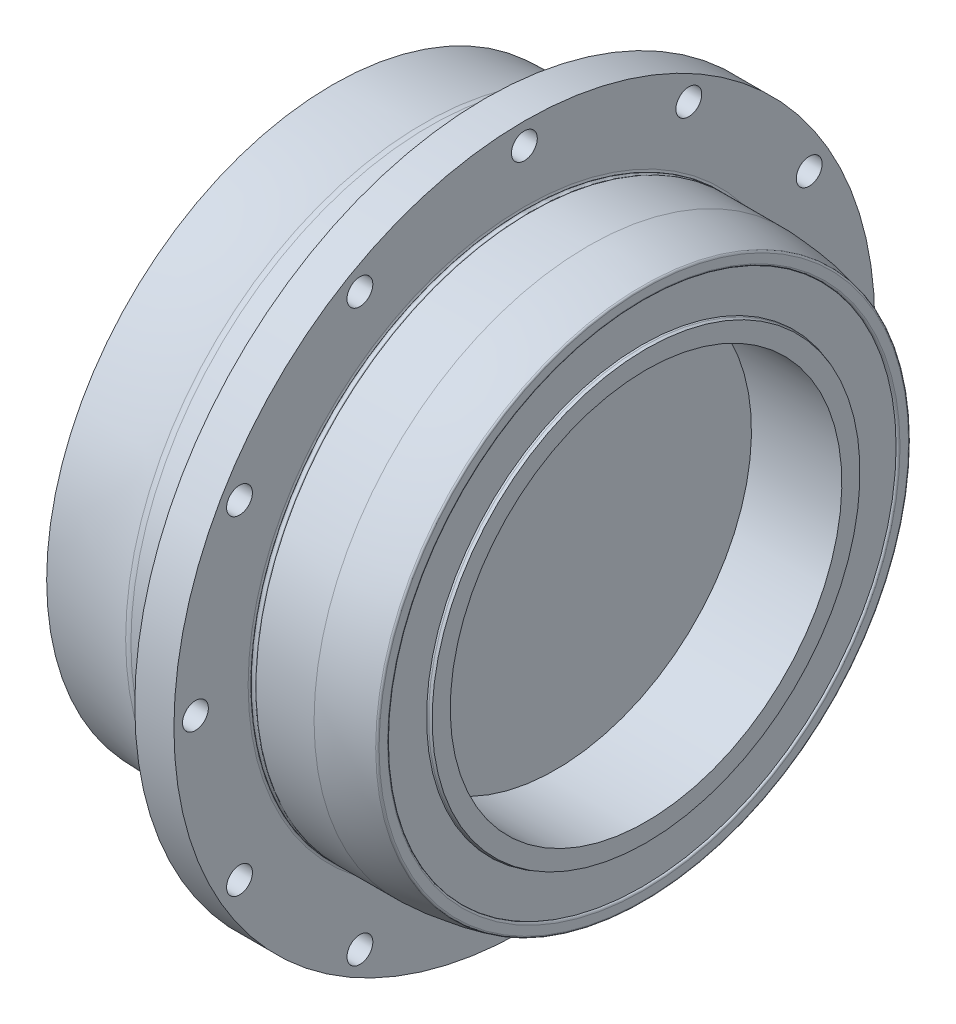
ISO-10303-21;
HEADER;
FILE_DESCRIPTION(('STEP AP214'),'2;1');
FILE_NAME('part.step','',(''),(''),'','','');
FILE_SCHEMA(('AUTOMOTIVE_DESIGN { 1 0 10303 214 1 1 1 1 }'));
ENDSEC;
DATA;
#1=APPLICATION_CONTEXT('core data for automotive mechanical design processes');
#2=APPLICATION_PROTOCOL_DEFINITION('international standard','automotive_design',2000,#1);
#3=PRODUCT_CONTEXT('',#1,'mechanical');
#4=PRODUCT('Part','Part','',(#3));
#5=PRODUCT_RELATED_PRODUCT_CATEGORY('part','',(#4));
#6=PRODUCT_DEFINITION_FORMATION('','',#4);
#7=PRODUCT_DEFINITION_CONTEXT('part definition',#1,'design');
#8=PRODUCT_DEFINITION('design','',#6,#7);
#9=PRODUCT_DEFINITION_SHAPE('','',#8);
#10=(LENGTH_UNIT() NAMED_UNIT(*) SI_UNIT(.MILLI.,.METRE.));
#11=(NAMED_UNIT(*) PLANE_ANGLE_UNIT() SI_UNIT($,.RADIAN.));
#12=(NAMED_UNIT(*) SI_UNIT($,.STERADIAN.) SOLID_ANGLE_UNIT());
#13=UNCERTAINTY_MEASURE_WITH_UNIT(LENGTH_MEASURE(1.E-05),#10,'distance_accuracy_value','');
#14=(GEOMETRIC_REPRESENTATION_CONTEXT(3) GLOBAL_UNCERTAINTY_ASSIGNED_CONTEXT((#13)) GLOBAL_UNIT_ASSIGNED_CONTEXT((#10,
#11,#12)) REPRESENTATION_CONTEXT('',''));
#15=CARTESIAN_POINT('',(0.,0.,0.));
#16=DIRECTION('',(0.,0.,1.));
#17=DIRECTION('',(1.,0.,0.));
#18=AXIS2_PLACEMENT_3D('',#15,#16,#17);
#19=CARTESIAN_POINT('',(56.9999999999999,0.,0.));
#20=DIRECTION('',(-1.,0.,0.));
#21=DIRECTION('',(0.,-1.,0.));
#22=AXIS2_PLACEMENT_3D('',#19,#20,#21);
#23=PLANE('',#22);
#24=CARTESIAN_POINT('',(56.9999999999999,0.,0.));
#25=DIRECTION('',(1.,0.,0.));
#26=DIRECTION('',(0.,1.,0.));
#27=AXIS2_PLACEMENT_3D('',#24,#25,#26);
#28=CIRCLE('',#27,50.);
#29=CARTESIAN_POINT('',(56.9999999999999,50.,0.));
#30=VERTEX_POINT('',#29);
#31=EDGE_CURVE('E271',#30,#30,#28,.T.);
#32=ORIENTED_EDGE('',*,*,#31,.T.);
#33=EDGE_LOOP('',(#32));
#34=FACE_BOUND('',#33,.T.);
#35=ADVANCED_FACE('F16',(#34),#23,.F.);
#36=CARTESIAN_POINT('',(86.9999999999999,0.,0.));
#37=DIRECTION('',(1.,0.,0.));
#38=DIRECTION('',(0.,1.,0.));
#39=AXIS2_PLACEMENT_3D('',#36,#37,#38);
#40=CYLINDRICAL_SURFACE('',#39,50.);
#41=CARTESIAN_POINT('',(80.0750000000017,0.,0.));
#42=DIRECTION('',(1.,0.,0.));
#43=DIRECTION('',(0.,1.,0.));
#44=AXIS2_PLACEMENT_3D('',#41,#42,#43);
#45=CIRCLE('',#44,50.);
#46=CARTESIAN_POINT('',(80.0750000000017,50.,0.));
#47=VERTEX_POINT('',#46);
#48=EDGE_CURVE('E269',#47,#47,#45,.T.);
#49=ORIENTED_EDGE('',*,*,#48,.T.);
#50=EDGE_LOOP('',(#49));
#51=FACE_BOUND('',#50,.T.);
#52=ORIENTED_EDGE('',*,*,#31,.F.);
#53=EDGE_LOOP('',(#52));
#54=FACE_BOUND('',#53,.T.);
#55=ADVANCED_FACE('F276',(#51,#54),#40,.F.);
#56=CARTESIAN_POINT('',(80.0750000000019,54.9999999999993,0.));
#57=DIRECTION('',(-1.,0.,0.));
#58=DIRECTION('',(0.,-1.,0.));
#59=AXIS2_PLACEMENT_3D('',#56,#57,#58);
#60=PLANE('',#59);
#61=ORIENTED_EDGE('',*,*,#48,.F.);
#62=EDGE_LOOP('',(#61));
#63=FACE_BOUND('',#62,.T.);
#64=CARTESIAN_POINT('',(80.0749999999993,-4.35852041343093E-13,0.));
#65=DIRECTION('',(-1.,0.,0.));
#66=DIRECTION('',(0.,-1.,0.));
#67=AXIS2_PLACEMENT_3D('',#64,#65,#66);
#68=CIRCLE('',#67,54.6360297657333);
#69=CARTESIAN_POINT('',(80.0749999999969,-54.6360297657338,0.));
#70=VERTEX_POINT('',#69);
#71=EDGE_CURVE('E266',#70,#70,#68,.T.);
#72=ORIENTED_EDGE('',*,*,#71,.F.);
#73=EDGE_LOOP('',(#72));
#74=FACE_BOUND('',#73,.T.);
#75=ADVANCED_FACE('F278',(#63,#74),#60,.F.);
#76=CARTESIAN_POINT('',(79.4063863252338,-4.05925293378572E-13,0.));
#77=DIRECTION('',(-1.,0.,0.));
#78=DIRECTION('',(0.,-1.,0.));
#79=AXIS2_PLACEMENT_3D('',#76,#77,#78);
#80=CONICAL_SURFACE('',#79,54.8793852415713,0.349065850398875);
#81=ORIENTED_EDGE('',*,*,#71,.T.);
#82=EDGE_LOOP('',(#81));
#83=FACE_BOUND('',#82,.T.);
#84=CARTESIAN_POINT('',(79.4063863252338,-4.06341254147805E-13,0.));
#85=DIRECTION('',(1.,0.,0.));
#86=DIRECTION('',(0.,1.,0.));
#87=AXIS2_PLACEMENT_3D('',#84,#85,#86);
#88=CIRCLE('',#87,54.8793852415713);
#89=CARTESIAN_POINT('',(79.4063863252363,54.8793852415709,0.));
#90=VERTEX_POINT('',#89);
#91=EDGE_CURVE('E265',#90,#90,#88,.F.);
#92=ORIENTED_EDGE('',*,*,#91,.F.);
#93=EDGE_LOOP('',(#92));
#94=FACE_BOUND('',#93,.T.);
#95=ADVANCED_FACE('F284',(#83,#94),#80,.T.);
#96=CARTESIAN_POINT('',(78.7223460385825,-3.75598464164455E-13,0.));
#97=DIRECTION('',(1.,0.,0.));
#98=DIRECTION('',(0.,1.,0.));
#99=AXIS2_PLACEMENT_3D('',#96,#97,#98);
#100=TOROIDAL_SURFACE('',#99,52.9999999999995,2.);
#101=CARTESIAN_POINT('',(79.,-3.88077052912043E-13,0.));
#102=DIRECTION('',(1.,0.,0.));
#103=DIRECTION('',(0.,1.,0.));
#104=AXIS2_PLACEMENT_3D('',#101,#102,#103);
#105=CIRCLE('',#104,54.9806333021807);
#106=CARTESIAN_POINT('',(79.0000000000025,54.9806333021803,0.));
#107=VERTEX_POINT('',#106);
#108=EDGE_CURVE('E262',#107,#107,#105,.F.);
#109=ORIENTED_EDGE('',*,*,#108,.F.);
#110=EDGE_LOOP('',(#109));
#111=FACE_BOUND('',#110,.T.);
#112=ORIENTED_EDGE('',*,*,#91,.T.);
#113=EDGE_LOOP('',(#112));
#114=FACE_BOUND('',#113,.T.);
#115=ADVANCED_FACE('F290',(#111,#114),#100,.T.);
#116=CARTESIAN_POINT('',(79.,0.,0.));
#117=DIRECTION('',(1.,0.,0.));
#118=DIRECTION('',(0.,0.,-1.));
#119=AXIS2_PLACEMENT_3D('',#116,#117,#118);
#120=PLANE('',#119);
#121=CARTESIAN_POINT('',(79.,0.,0.));
#122=DIRECTION('',(1.,0.,0.));
#123=DIRECTION('',(0.,0.,-1.));
#124=AXIS2_PLACEMENT_3D('',#121,#122,#123);
#125=CIRCLE('',#124,64.94);
#126=CARTESIAN_POINT('',(79.,0.,-64.94));
#127=VERTEX_POINT('',#126);
#128=EDGE_CURVE('E69',#127,#127,#125,.F.);
#129=ORIENTED_EDGE('',*,*,#128,.F.);
#130=EDGE_LOOP('',(#129));
#131=FACE_BOUND('',#130,.T.);
#132=ORIENTED_EDGE('',*,*,#108,.T.);
#133=EDGE_LOOP('',(#132));
#134=FACE_BOUND('',#133,.T.);
#135=ADVANCED_FACE('F295',(#131,#134),#120,.T.);
#136=CARTESIAN_POINT('',(79.,0.,0.));
#137=DIRECTION('',(1.,0.,0.));
#138=DIRECTION('',(0.,0.,-1.));
#139=AXIS2_PLACEMENT_3D('',#136,#137,#138);
#140=TOROIDAL_SURFACE('',#139,65.44,0.5);
#141=CARTESIAN_POINT('',(79.5,0.,0.));
#142=DIRECTION('',(1.,0.,0.));
#143=DIRECTION('',(0.,0.,1.));
#144=AXIS2_PLACEMENT_3D('',#141,#142,#143);
#145=CIRCLE('',#144,65.44);
#146=CARTESIAN_POINT('',(79.5,0.,-65.44));
#147=VERTEX_POINT('',#146);
#148=CARTESIAN_POINT('',(79.5,0.,65.44));
#149=VERTEX_POINT('',#148);
#150=EDGE_CURVE('E56',#147,#149,#145,.F.);
#151=ORIENTED_EDGE('',*,*,#150,.F.);
#152=CARTESIAN_POINT('',(79.5,0.,0.));
#153=DIRECTION('',(1.,0.,0.));
#154=DIRECTION('',(0.,0.,-1.));
#155=AXIS2_PLACEMENT_3D('',#152,#153,#154);
#156=CIRCLE('',#155,65.44);
#157=EDGE_CURVE('E59',#149,#147,#156,.F.);
#158=ORIENTED_EDGE('',*,*,#157,.F.);
#159=EDGE_LOOP('',(#151,#158));
#160=FACE_BOUND('',#159,.T.);
#161=ORIENTED_EDGE('',*,*,#128,.T.);
#162=EDGE_LOOP('',(#161));
#163=FACE_BOUND('',#162,.T.);
#164=ADVANCED_FACE('F67',(#160,#163),#140,.T.);
#165=CARTESIAN_POINT('',(79.5,68.,0.));
#166=DIRECTION('',(1.,0.,0.));
#167=DIRECTION('',(0.,0.,-1.));
#168=AXIS2_PLACEMENT_3D('',#165,#166,#167);
#169=PLANE('',#168);
#170=CARTESIAN_POINT('',(79.5,0.,0.));
#171=DIRECTION('',(-1.,0.,0.));
#172=DIRECTION('',(0.,0.,1.));
#173=AXIS2_PLACEMENT_3D('',#170,#171,#172);
#174=CIRCLE('',#173,67.6111283110141);
#175=CARTESIAN_POINT('',(79.5,0.,67.6111283110141));
#176=VERTEX_POINT('',#175);
#177=CARTESIAN_POINT('',(79.5,0.,-67.6111283110141));
#178=VERTEX_POINT('',#177);
#179=EDGE_CURVE('E106',#176,#178,#174,.T.);
#180=ORIENTED_EDGE('',*,*,#179,.F.);
#181=CARTESIAN_POINT('',(79.5,0.,0.));
#182=DIRECTION('',(-1.,0.,0.));
#183=DIRECTION('',(0.,0.,-1.));
#184=AXIS2_PLACEMENT_3D('',#181,#182,#183);
#185=CIRCLE('',#184,67.6111283110141);
#186=EDGE_CURVE('E64',#178,#176,#185,.T.);
#187=ORIENTED_EDGE('',*,*,#186,.F.);
#188=EDGE_LOOP('',(#180,#187));
#189=FACE_BOUND('',#188,.T.);
#190=ORIENTED_EDGE('',*,*,#150,.T.);
#191=ORIENTED_EDGE('',*,*,#157,.T.);
#192=EDGE_LOOP('',(#190,#191));
#193=FACE_BOUND('',#192,.T.);
#194=ADVANCED_FACE('F61',(#189,#193),#169,.T.);
#195=CARTESIAN_POINT('',(79.,0.,0.));
#196=DIRECTION('',(1.,0.,0.));
#197=DIRECTION('',(0.,0.,-1.));
#198=AXIS2_PLACEMENT_3D('',#195,#196,#197);
#199=TOROIDAL_SURFACE('',#198,67.6111283110141,0.5);
#200=CARTESIAN_POINT('',(79.121621327082,0.,0.));
#201=DIRECTION('',(-1.,0.,0.));
#202=DIRECTION('',(0.,0.,1.));
#203=AXIS2_PLACEMENT_3D('',#200,#201,#202);
#204=CIRCLE('',#203,68.0961110455509);
#205=CARTESIAN_POINT('',(79.121621327082,0.,68.0961110455509));
#206=VERTEX_POINT('',#205);
#207=EDGE_CURVE('E96',#206,#206,#204,.T.);
#208=ORIENTED_EDGE('',*,*,#207,.F.);
#209=EDGE_LOOP('',(#208));
#210=FACE_BOUND('',#209,.T.);
#211=ORIENTED_EDGE('',*,*,#179,.T.);
#212=ORIENTED_EDGE('',*,*,#186,.T.);
#213=EDGE_LOOP('',(#211,#212));
#214=FACE_BOUND('',#213,.T.);
#215=ADVANCED_FACE('F76',(#210,#214),#199,.T.);
#216=CARTESIAN_POINT('',(63.5,0.,5.8026234567902));
#217=DIRECTION('',(0.,1.,0.));
#218=DIRECTION('',(0.,0.,1.));
#219=AXIS2_PLACEMENT_3D('',#216,#217,#218);
#220=CIRCLE('',#219,64.2223765432098);
#221=TRIMMED_CURVE('',#220,(PARAMETER_VALUE(-1.66127176324042)),
(PARAMETER_VALUE(1.66127176324042)),.T.,.PARAMETER.);
#222=CARTESIAN_POINT('',(63.5,0.,0.));
#223=DIRECTION('',(-1.,0.,0.));
#224=AXIS1_PLACEMENT('',#222,#223);
#225=SURFACE_OF_REVOLUTION('',#221,#224);
#226=ORIENTED_EDGE('',*,*,#207,.T.);
#227=EDGE_LOOP('',(#226));
#228=FACE_BOUND('',#227,.T.);
#229=CARTESIAN_POINT('',(65.2917850951385,0.,0.));
#230=DIRECTION('',(1.,0.,0.));
#231=DIRECTION('',(0.,0.,-1.));
#232=AXIS2_PLACEMENT_3D('',#229,#230,#231);
#233=CIRCLE('',#232,70.);
#234=CARTESIAN_POINT('',(65.2917850951385,0.,-70.));
#235=VERTEX_POINT('',#234);
#236=EDGE_CURVE('E105',#235,#235,#233,.F.);
#237=ORIENTED_EDGE('',*,*,#236,.F.);
#238=EDGE_LOOP('',(#237));
#239=FACE_BOUND('',#238,.T.);
#240=ADVANCED_FACE('F87',(#228,#239),#225,.F.);
#241=CARTESIAN_POINT('',(59.,0.,0.));
#242=DIRECTION('',(1.,0.,0.));
#243=DIRECTION('',(0.,0.,-1.));
#244=AXIS2_PLACEMENT_3D('',#241,#242,#243);
#245=CYLINDRICAL_SURFACE('',#244,70.);
#246=ORIENTED_EDGE('',*,*,#236,.T.);
#247=EDGE_LOOP('',(#246));
#248=FACE_BOUND('',#247,.T.);
#249=CARTESIAN_POINT('',(50.4473720558371,0.,0.));
#250=DIRECTION('',(1.,0.,0.));
#251=DIRECTION('',(0.,0.,-1.));
#252=AXIS2_PLACEMENT_3D('',#249,#250,#251);
#253=CIRCLE('',#252,70.);
#254=CARTESIAN_POINT('',(50.4473720558371,0.,-70.));
#255=VERTEX_POINT('',#254);
#256=EDGE_CURVE('E111',#255,#255,#253,.F.);
#257=ORIENTED_EDGE('',*,*,#256,.F.);
#258=EDGE_LOOP('',(#257));
#259=FACE_BOUND('',#258,.T.);
#260=ADVANCED_FACE('F131',(#248,#259),#245,.T.);
#261=CARTESIAN_POINT('',(50.4473720558371,0.,0.));
#262=DIRECTION('',(1.,0.,0.));
#263=DIRECTION('',(0.,0.,-1.));
#264=AXIS2_PLACEMENT_3D('',#261,#262,#263);
#265=CONICAL_SURFACE('',#264,70.,0.523598775598297);
#266=CARTESIAN_POINT('',(50.2,0.,0.));
#267=DIRECTION('',(-1.,0.,0.));
#268=DIRECTION('',(0.,0.,1.));
#269=AXIS2_PLACEMENT_3D('',#266,#267,#268);
#270=CIRCLE('',#269,69.8571796769725);
#271=CARTESIAN_POINT('',(50.2,0.,69.8571796769725));
#272=VERTEX_POINT('',#271);
#273=EDGE_CURVE('E114',#272,#272,#270,.F.);
#274=ORIENTED_EDGE('',*,*,#273,.T.);
#275=EDGE_LOOP('',(#274));
#276=FACE_BOUND('',#275,.T.);
#277=ORIENTED_EDGE('',*,*,#256,.T.);
#278=EDGE_LOOP('',(#277));
#279=FACE_BOUND('',#278,.T.);
#280=ADVANCED_FACE('F127',(#276,#279),#265,.T.);
#281=CARTESIAN_POINT('',(49.8,0.,0.));
#282=DIRECTION('',(-1.,0.,0.));
#283=DIRECTION('',(0.,0.,1.));
#284=AXIS2_PLACEMENT_3D('',#281,#282,#283);
#285=TOROIDAL_SURFACE('',#284,70.55,0.799999999999997);
#286=ORIENTED_EDGE('',*,*,#273,.F.);
#287=EDGE_LOOP('',(#286));
#288=FACE_BOUND('',#287,.T.);
#289=CARTESIAN_POINT('',(49.2190524980689,0.,0.));
#290=DIRECTION('',(1.,0.,0.));
#291=DIRECTION('',(0.,0.,-1.));
#292=AXIS2_PLACEMENT_3D('',#289,#290,#291);
#293=CIRCLE('',#292,70.);
#294=CARTESIAN_POINT('',(49.2190524980689,0.,-70.));
#295=VERTEX_POINT('',#294);
#296=EDGE_CURVE('E117',#295,#295,#293,.F.);
#297=ORIENTED_EDGE('',*,*,#296,.F.);
#298=EDGE_LOOP('',(#297));
#299=FACE_BOUND('',#298,.T.);
#300=ADVANCED_FACE('F122',(#288,#299),#285,.F.);
#301=CARTESIAN_POINT('',(59.,0.,0.));
#302=DIRECTION('',(1.,0.,0.));
#303=DIRECTION('',(0.,0.,-1.));
#304=AXIS2_PLACEMENT_3D('',#301,#302,#303);
#305=CYLINDRICAL_SURFACE('',#304,70.);
#306=ORIENTED_EDGE('',*,*,#296,.T.);
#307=EDGE_LOOP('',(#306));
#308=FACE_BOUND('',#307,.T.);
#309=CARTESIAN_POINT('',(49.,0.,0.));
#310=DIRECTION('',(1.,0.,0.));
#311=DIRECTION('',(0.,0.,-1.));
#312=AXIS2_PLACEMENT_3D('',#309,#310,#311);
#313=CIRCLE('',#312,70.);
#314=CARTESIAN_POINT('',(49.,0.,-70.));
#315=VERTEX_POINT('',#314);
#316=EDGE_CURVE('E250',#315,#315,#313,.T.);
#317=ORIENTED_EDGE('',*,*,#316,.T.);
#318=EDGE_LOOP('',(#317));
#319=FACE_BOUND('',#318,.T.);
#320=ADVANCED_FACE('F126',(#308,#319),#305,.T.);
#321=CARTESIAN_POINT('',(49.,0.,0.));
#322=DIRECTION('',(-1.,0.,0.));
#323=DIRECTION('',(0.,0.,1.));
#324=AXIS2_PLACEMENT_3D('',#321,#322,#323);
#325=PLANE('',#324);
#326=CARTESIAN_POINT('',(49.,0.,0.));
#327=DIRECTION('',(1.,0.,0.));
#328=DIRECTION('',(0.,0.,-1.));
#329=AXIS2_PLACEMENT_3D('',#326,#327,#328);
#330=CIRCLE('',#329,70.025);
#331=CARTESIAN_POINT('',(49.,0.,-70.025));
#332=VERTEX_POINT('',#331);
#333=EDGE_CURVE('E246',#332,#332,#330,.T.);
#334=ORIENTED_EDGE('',*,*,#333,.T.);
#335=EDGE_LOOP('',(#334));
#336=FACE_BOUND('',#335,.T.);
#337=ORIENTED_EDGE('',*,*,#316,.F.);
#338=EDGE_LOOP('',(#337));
#339=FACE_BOUND('',#338,.T.);
#340=ADVANCED_FACE('F694',(#336,#339),#325,.F.);
#341=CARTESIAN_POINT('',(0.,0.,0.));
#342=DIRECTION('',(1.,0.,0.));
#343=DIRECTION('',(0.,0.,-1.));
#344=AXIS2_PLACEMENT_3D('',#341,#342,#343);
#345=CYLINDRICAL_SURFACE('',#344,70.025);
#346=ORIENTED_EDGE('',*,*,#333,.F.);
#347=EDGE_LOOP('',(#346));
#348=FACE_BOUND('',#347,.T.);
#349=CARTESIAN_POINT('',(49.1963651766175,0.,0.));
#350=DIRECTION('',(-1.,0.,0.));
#351=DIRECTION('',(0.,0.,1.));
#352=AXIS2_PLACEMENT_3D('',#349,#350,#351);
#353=CIRCLE('',#352,70.025);
#354=CARTESIAN_POINT('',(49.1963651766175,0.,70.025));
#355=VERTEX_POINT('',#354);
#356=EDGE_CURVE('E239',#355,#355,#353,.F.);
#357=ORIENTED_EDGE('',*,*,#356,.T.);
#358=EDGE_LOOP('',(#357));
#359=FACE_BOUND('',#358,.T.);
#360=ADVANCED_FACE('F224',(#348,#359),#345,.F.);
#361=CARTESIAN_POINT('',(49.8,0.,0.));
#362=DIRECTION('',(-1.,0.,0.));
#363=DIRECTION('',(0.,0.,1.));
#364=AXIS2_PLACEMENT_3D('',#361,#362,#363);
#365=TOROIDAL_SURFACE('',#364,70.55,0.799999999999997);
#366=ORIENTED_EDGE('',*,*,#356,.F.);
#367=EDGE_LOOP('',(#366));
#368=FACE_BOUND('',#367,.T.);
#369=CARTESIAN_POINT('',(49.,0.,0.));
#370=DIRECTION('',(1.,0.,0.));
#371=DIRECTION('',(0.,0.,1.));
#372=AXIS2_PLACEMENT_3D('',#369,#370,#371);
#373=CIRCLE('',#372,70.55);
#374=CARTESIAN_POINT('',(49.,0.,-70.55));
#375=VERTEX_POINT('',#374);
#376=CARTESIAN_POINT('',(49.,0.,70.55));
#377=VERTEX_POINT('',#376);
#378=EDGE_CURVE('E208',#375,#377,#373,.F.);
#379=ORIENTED_EDGE('',*,*,#378,.F.);
#380=CARTESIAN_POINT('',(49.,0.,0.));
#381=DIRECTION('',(1.,0.,0.));
#382=DIRECTION('',(0.,0.,-1.));
#383=AXIS2_PLACEMENT_3D('',#380,#381,#382);
#384=CIRCLE('',#383,70.55);
#385=EDGE_CURVE('E236',#377,#375,#384,.F.);
#386=ORIENTED_EDGE('',*,*,#385,.F.);
#387=EDGE_LOOP('',(#379,#386));
#388=FACE_BOUND('',#387,.T.);
#389=ADVANCED_FACE('F212',(#368,#388),#365,.F.);
#390=CARTESIAN_POINT('',(49.,89.5,0.));
#391=DIRECTION('',(1.,0.,0.));
#392=DIRECTION('',(0.,0.,-1.));
#393=AXIS2_PLACEMENT_3D('',#390,#391,#392);
#394=PLANE('',#393);
#395=CARTESIAN_POINT('',(49.,0.,0.));
#396=DIRECTION('',(1.,0.,0.));
#397=DIRECTION('',(0.,0.,-1.));
#398=AXIS2_PLACEMENT_3D('',#395,#396,#397);
#399=CIRCLE('',#398,89.5);
#400=CARTESIAN_POINT('',(49.,0.,-89.5));
#401=VERTEX_POINT('',#400);
#402=EDGE_CURVE('E347',#401,#401,#399,.F.);
#403=ORIENTED_EDGE('',*,*,#402,.F.);
#404=EDGE_LOOP('',(#403));
#405=FACE_BOUND('',#404,.T.);
#406=CARTESIAN_POINT('',(49.,84.,0.));
#407=DIRECTION('',(-1.,0.,0.));
#408=DIRECTION('',(0.,0.,1.));
#409=AXIS2_PLACEMENT_3D('',#406,#407,#408);
#410=CIRCLE('',#409,3.3);
#411=CARTESIAN_POINT('',(49.,84.,3.3));
#412=VERTEX_POINT('',#411);
#413=EDGE_CURVE('E350',#412,#412,#410,.T.);
#414=ORIENTED_EDGE('',*,*,#413,.T.);
#415=EDGE_LOOP('',(#414));
#416=FACE_BOUND('',#415,.T.);
#417=CARTESIAN_POINT('',(49.,72.7461339178929,42.));
#418=DIRECTION('',(-1.,0.,0.));
#419=DIRECTION('',(0.,0.,1.));
#420=AXIS2_PLACEMENT_3D('',#417,#418,#419);
#421=CIRCLE('',#420,3.3);
#422=CARTESIAN_POINT('',(49.,72.7461339178929,45.3));
#423=VERTEX_POINT('',#422);
#424=EDGE_CURVE('E353',#423,#423,#421,.T.);
#425=ORIENTED_EDGE('',*,*,#424,.T.);
#426=EDGE_LOOP('',(#425));
#427=FACE_BOUND('',#426,.T.);
#428=CARTESIAN_POINT('',(49.,42.,72.7461339178928));
#429=DIRECTION('',(-1.,0.,0.));
#430=DIRECTION('',(0.,0.,1.));
#431=AXIS2_PLACEMENT_3D('',#428,#429,#430);
#432=CIRCLE('',#431,3.3);
#433=CARTESIAN_POINT('',(49.,42.,76.0461339178928));
#434=VERTEX_POINT('',#433);
#435=EDGE_CURVE('E356',#434,#434,#432,.T.);
#436=ORIENTED_EDGE('',*,*,#435,.T.);
#437=EDGE_LOOP('',(#436));
#438=FACE_BOUND('',#437,.T.);
#439=CARTESIAN_POINT('',(49.,0.,84.));
#440=DIRECTION('',(-1.,0.,0.));
#441=DIRECTION('',(0.,0.,1.));
#442=AXIS2_PLACEMENT_3D('',#439,#440,#441);
#443=CIRCLE('',#442,3.3);
#444=CARTESIAN_POINT('',(49.,0.,87.3));
#445=VERTEX_POINT('',#444);
#446=EDGE_CURVE('E359',#445,#445,#443,.T.);
#447=ORIENTED_EDGE('',*,*,#446,.T.);
#448=EDGE_LOOP('',(#447));
#449=FACE_BOUND('',#448,.T.);
#450=CARTESIAN_POINT('',(49.,-42.,72.7461339178929));
#451=DIRECTION('',(-1.,0.,0.));
#452=DIRECTION('',(0.,0.,1.));
#453=AXIS2_PLACEMENT_3D('',#450,#451,#452);
#454=CIRCLE('',#453,3.3);
#455=CARTESIAN_POINT('',(49.,-42.,76.0461339178929));
#456=VERTEX_POINT('',#455);
#457=EDGE_CURVE('E362',#456,#456,#454,.T.);
#458=ORIENTED_EDGE('',*,*,#457,.T.);
#459=EDGE_LOOP('',(#458));
#460=FACE_BOUND('',#459,.T.);
#461=CARTESIAN_POINT('',(49.,-72.7461339178928,42.));
#462=DIRECTION('',(-1.,0.,0.));
#463=DIRECTION('',(0.,0.,1.));
#464=AXIS2_PLACEMENT_3D('',#461,#462,#463);
#465=CIRCLE('',#464,3.3);
#466=CARTESIAN_POINT('',(49.,-72.7461339178928,45.3));
#467=VERTEX_POINT('',#466);
#468=EDGE_CURVE('E365',#467,#467,#465,.T.);
#469=ORIENTED_EDGE('',*,*,#468,.T.);
#470=EDGE_LOOP('',(#469));
#471=FACE_BOUND('',#470,.T.);
#472=CARTESIAN_POINT('',(49.,-84.,0.));
#473=DIRECTION('',(-1.,0.,0.));
#474=DIRECTION('',(0.,0.,1.));
#475=AXIS2_PLACEMENT_3D('',#472,#473,#474);
#476=CIRCLE('',#475,3.3);
#477=CARTESIAN_POINT('',(49.,-84.,3.30000000000005));
#478=VERTEX_POINT('',#477);
#479=EDGE_CURVE('E368',#478,#478,#476,.T.);
#480=ORIENTED_EDGE('',*,*,#479,.T.);
#481=EDGE_LOOP('',(#480));
#482=FACE_BOUND('',#481,.T.);
#483=CARTESIAN_POINT('',(49.,-72.7461339178929,-42.));
#484=DIRECTION('',(-1.,0.,0.));
#485=DIRECTION('',(0.,0.,1.));
#486=AXIS2_PLACEMENT_3D('',#483,#484,#485);
#487=CIRCLE('',#486,3.3);
#488=CARTESIAN_POINT('',(49.,-72.7461339178929,-38.7));
#489=VERTEX_POINT('',#488);
#490=EDGE_CURVE('E371',#489,#489,#487,.T.);
#491=ORIENTED_EDGE('',*,*,#490,.T.);
#492=EDGE_LOOP('',(#491));
#493=FACE_BOUND('',#492,.T.);
#494=CARTESIAN_POINT('',(49.,-42.0000000000001,-72.7461339178928));
#495=DIRECTION('',(-1.,0.,0.));
#496=DIRECTION('',(0.,0.,1.));
#497=AXIS2_PLACEMENT_3D('',#494,#495,#496);
#498=CIRCLE('',#497,3.3);
#499=CARTESIAN_POINT('',(49.,-42.0000000000001,-69.4461339178928));
#500=VERTEX_POINT('',#499);
#501=EDGE_CURVE('E374',#500,#500,#498,.T.);
#502=ORIENTED_EDGE('',*,*,#501,.T.);
#503=EDGE_LOOP('',(#502));
#504=FACE_BOUND('',#503,.T.);
#505=CARTESIAN_POINT('',(49.,0.,-84.));
#506=DIRECTION('',(-1.,0.,0.));
#507=DIRECTION('',(0.,0.,1.));
#508=AXIS2_PLACEMENT_3D('',#505,#506,#507);
#509=CIRCLE('',#508,3.3);
#510=CARTESIAN_POINT('',(49.,0.,-80.7));
#511=VERTEX_POINT('',#510);
#512=EDGE_CURVE('E377',#511,#511,#509,.T.);
#513=ORIENTED_EDGE('',*,*,#512,.T.);
#514=EDGE_LOOP('',(#513));
#515=FACE_BOUND('',#514,.T.);
#516=CARTESIAN_POINT('',(49.,41.9999999999999,-72.7461339178929));
#517=DIRECTION('',(-1.,0.,0.));
#518=DIRECTION('',(0.,0.,1.));
#519=AXIS2_PLACEMENT_3D('',#516,#517,#518);
#520=CIRCLE('',#519,3.3);
#521=CARTESIAN_POINT('',(49.,41.9999999999999,-69.4461339178929));
#522=VERTEX_POINT('',#521);
#523=EDGE_CURVE('E379',#522,#522,#520,.T.);
#524=ORIENTED_EDGE('',*,*,#523,.T.);
#525=EDGE_LOOP('',(#524));
#526=FACE_BOUND('',#525,.T.);
#527=CARTESIAN_POINT('',(49.,72.7461339178928,-42.0000000000001));
#528=DIRECTION('',(-1.,0.,0.));
#529=DIRECTION('',(0.,0.,1.));
#530=AXIS2_PLACEMENT_3D('',#527,#528,#529);
#531=CIRCLE('',#530,3.3);
#532=CARTESIAN_POINT('',(49.,72.7461339178928,-38.7000000000001));
#533=VERTEX_POINT('',#532);
#534=EDGE_CURVE('E257',#533,#533,#531,.T.);
#535=ORIENTED_EDGE('',*,*,#534,.T.);
#536=EDGE_LOOP('',(#535));
#537=FACE_BOUND('',#536,.T.);
#538=ORIENTED_EDGE('',*,*,#378,.T.);
#539=ORIENTED_EDGE('',*,*,#385,.T.);
#540=EDGE_LOOP('',(#538,#539));
#541=FACE_BOUND('',#540,.T.);
#542=ADVANCED_FACE('F223',(#405,#416,#427,#438,#449,#460,#471,#482,#493,#504,#515,#526,#537,
#541),#394,.T.);
#543=CARTESIAN_POINT('',(39.,72.7461339178928,-42.0000000000001));
#544=DIRECTION('',(-1.,0.,0.));
#545=DIRECTION('',(0.,0.,1.));
#546=AXIS2_PLACEMENT_3D('',#543,#544,#545);
#547=CYLINDRICAL_SURFACE('',#546,3.3);
#548=CARTESIAN_POINT('',(39.,72.7461339178928,-42.0000000000001));
#549=DIRECTION('',(-1.,0.,0.));
#550=DIRECTION('',(0.,0.,1.));
#551=AXIS2_PLACEMENT_3D('',#548,#549,#550);
#552=CIRCLE('',#551,3.3);
#553=CARTESIAN_POINT('',(39.,72.7461339178928,-38.7000000000001));
#554=VERTEX_POINT('',#553);
#555=EDGE_CURVE('E344',#554,#554,#552,.F.);
#556=ORIENTED_EDGE('',*,*,#555,.F.);
#557=EDGE_LOOP('',(#556));
#558=FACE_BOUND('',#557,.T.);
#559=ORIENTED_EDGE('',*,*,#534,.F.);
#560=EDGE_LOOP('',(#559));
#561=FACE_BOUND('',#560,.T.);
#562=ADVANCED_FACE('F396',(#558,#561),#547,.F.);
#563=CARTESIAN_POINT('',(39.,41.9999999999999,-72.7461339178929));
#564=DIRECTION('',(-1.,0.,0.));
#565=DIRECTION('',(0.,0.,1.));
#566=AXIS2_PLACEMENT_3D('',#563,#564,#565);
#567=CYLINDRICAL_SURFACE('',#566,3.3);
#568=CARTESIAN_POINT('',(39.,41.9999999999999,-72.7461339178929));
#569=DIRECTION('',(-1.,0.,0.));
#570=DIRECTION('',(0.,0.,1.));
#571=AXIS2_PLACEMENT_3D('',#568,#569,#570);
#572=CIRCLE('',#571,3.3);
#573=CARTESIAN_POINT('',(39.,41.9999999999999,-69.4461339178929));
#574=VERTEX_POINT('',#573);
#575=EDGE_CURVE('E341',#574,#574,#572,.F.);
#576=ORIENTED_EDGE('',*,*,#575,.F.);
#577=EDGE_LOOP('',(#576));
#578=FACE_BOUND('',#577,.T.);
#579=ORIENTED_EDGE('',*,*,#523,.F.);
#580=EDGE_LOOP('',(#579));
#581=FACE_BOUND('',#580,.T.);
#582=ADVANCED_FACE('F401',(#578,#581),#567,.F.);
#583=CARTESIAN_POINT('',(39.,0.,-84.));
#584=DIRECTION('',(-1.,0.,0.));
#585=DIRECTION('',(0.,0.,1.));
#586=AXIS2_PLACEMENT_3D('',#583,#584,#585);
#587=CYLINDRICAL_SURFACE('',#586,3.3);
#588=CARTESIAN_POINT('',(39.,0.,-84.));
#589=DIRECTION('',(-1.,0.,0.));
#590=DIRECTION('',(0.,0.,1.));
#591=AXIS2_PLACEMENT_3D('',#588,#589,#590);
#592=CIRCLE('',#591,3.3);
#593=CARTESIAN_POINT('',(39.,0.,-80.7));
#594=VERTEX_POINT('',#593);
#595=EDGE_CURVE('E338',#594,#594,#592,.F.);
#596=ORIENTED_EDGE('',*,*,#595,.F.);
#597=EDGE_LOOP('',(#596));
#598=FACE_BOUND('',#597,.T.);
#599=ORIENTED_EDGE('',*,*,#512,.F.);
#600=EDGE_LOOP('',(#599));
#601=FACE_BOUND('',#600,.T.);
#602=ADVANCED_FACE('F425',(#598,#601),#587,.F.);
#603=CARTESIAN_POINT('',(39.,-42.0000000000001,-72.7461339178928));
#604=DIRECTION('',(-1.,0.,0.));
#605=DIRECTION('',(0.,0.,1.));
#606=AXIS2_PLACEMENT_3D('',#603,#604,#605);
#607=CYLINDRICAL_SURFACE('',#606,3.3);
#608=CARTESIAN_POINT('',(39.,-42.0000000000001,-72.7461339178928));
#609=DIRECTION('',(-1.,0.,0.));
#610=DIRECTION('',(0.,0.,1.));
#611=AXIS2_PLACEMENT_3D('',#608,#609,#610);
#612=CIRCLE('',#611,3.3);
#613=CARTESIAN_POINT('',(39.,-42.0000000000001,-69.4461339178928));
#614=VERTEX_POINT('',#613);
#615=EDGE_CURVE('E335',#614,#614,#612,.F.);
#616=ORIENTED_EDGE('',*,*,#615,.F.);
#617=EDGE_LOOP('',(#616));
#618=FACE_BOUND('',#617,.T.);
#619=ORIENTED_EDGE('',*,*,#501,.F.);
#620=EDGE_LOOP('',(#619));
#621=FACE_BOUND('',#620,.T.);
#622=ADVANCED_FACE('F427',(#618,#621),#607,.F.);
#623=CARTESIAN_POINT('',(39.,-72.7461339178929,-42.));
#624=DIRECTION('',(-1.,0.,0.));
#625=DIRECTION('',(0.,0.,1.));
#626=AXIS2_PLACEMENT_3D('',#623,#624,#625);
#627=CYLINDRICAL_SURFACE('',#626,3.3);
#628=CARTESIAN_POINT('',(39.,-72.7461339178929,-42.));
#629=DIRECTION('',(-1.,0.,0.));
#630=DIRECTION('',(0.,0.,1.));
#631=AXIS2_PLACEMENT_3D('',#628,#629,#630);
#632=CIRCLE('',#631,3.3);
#633=CARTESIAN_POINT('',(39.,-72.7461339178929,-38.7));
#634=VERTEX_POINT('',#633);
#635=EDGE_CURVE('E332',#634,#634,#632,.F.);
#636=ORIENTED_EDGE('',*,*,#635,.F.);
#637=EDGE_LOOP('',(#636));
#638=FACE_BOUND('',#637,.T.);
#639=ORIENTED_EDGE('',*,*,#490,.F.);
#640=EDGE_LOOP('',(#639));
#641=FACE_BOUND('',#640,.T.);
#642=ADVANCED_FACE('F434',(#638,#641),#627,.F.);
#643=CARTESIAN_POINT('',(39.,-84.,0.));
#644=DIRECTION('',(-1.,0.,0.));
#645=DIRECTION('',(0.,0.,1.));
#646=AXIS2_PLACEMENT_3D('',#643,#644,#645);
#647=CYLINDRICAL_SURFACE('',#646,3.3);
#648=CARTESIAN_POINT('',(39.,-84.,0.));
#649=DIRECTION('',(-1.,0.,0.));
#650=DIRECTION('',(0.,0.,1.));
#651=AXIS2_PLACEMENT_3D('',#648,#649,#650);
#652=CIRCLE('',#651,3.3);
#653=CARTESIAN_POINT('',(39.,-84.,3.30000000000005));
#654=VERTEX_POINT('',#653);
#655=EDGE_CURVE('E329',#654,#654,#652,.F.);
#656=ORIENTED_EDGE('',*,*,#655,.F.);
#657=EDGE_LOOP('',(#656));
#658=FACE_BOUND('',#657,.T.);
#659=ORIENTED_EDGE('',*,*,#479,.F.);
#660=EDGE_LOOP('',(#659));
#661=FACE_BOUND('',#660,.T.);
#662=ADVANCED_FACE('F443',(#658,#661),#647,.F.);
#663=CARTESIAN_POINT('',(39.,-72.7461339178928,42.));
#664=DIRECTION('',(-1.,0.,0.));
#665=DIRECTION('',(0.,0.,1.));
#666=AXIS2_PLACEMENT_3D('',#663,#664,#665);
#667=CYLINDRICAL_SURFACE('',#666,3.3);
#668=CARTESIAN_POINT('',(39.,-72.7461339178928,42.));
#669=DIRECTION('',(-1.,0.,0.));
#670=DIRECTION('',(0.,0.,1.));
#671=AXIS2_PLACEMENT_3D('',#668,#669,#670);
#672=CIRCLE('',#671,3.3);
#673=CARTESIAN_POINT('',(39.,-72.7461339178928,45.3));
#674=VERTEX_POINT('',#673);
#675=EDGE_CURVE('E326',#674,#674,#672,.F.);
#676=ORIENTED_EDGE('',*,*,#675,.F.);
#677=EDGE_LOOP('',(#676));
#678=FACE_BOUND('',#677,.T.);
#679=ORIENTED_EDGE('',*,*,#468,.F.);
#680=EDGE_LOOP('',(#679));
#681=FACE_BOUND('',#680,.T.);
#682=ADVANCED_FACE('F447',(#678,#681),#667,.F.);
#683=CARTESIAN_POINT('',(39.,-42.,72.7461339178929));
#684=DIRECTION('',(-1.,0.,0.));
#685=DIRECTION('',(0.,0.,1.));
#686=AXIS2_PLACEMENT_3D('',#683,#684,#685);
#687=CYLINDRICAL_SURFACE('',#686,3.3);
#688=CARTESIAN_POINT('',(39.,-42.,72.7461339178929));
#689=DIRECTION('',(-1.,0.,0.));
#690=DIRECTION('',(0.,0.,1.));
#691=AXIS2_PLACEMENT_3D('',#688,#689,#690);
#692=CIRCLE('',#691,3.3);
#693=CARTESIAN_POINT('',(39.,-42.,76.0461339178929));
#694=VERTEX_POINT('',#693);
#695=EDGE_CURVE('E323',#694,#694,#692,.F.);
#696=ORIENTED_EDGE('',*,*,#695,.F.);
#697=EDGE_LOOP('',(#696));
#698=FACE_BOUND('',#697,.T.);
#699=ORIENTED_EDGE('',*,*,#457,.F.);
#700=EDGE_LOOP('',(#699));
#701=FACE_BOUND('',#700,.T.);
#702=ADVANCED_FACE('F451',(#698,#701),#687,.F.);
#703=CARTESIAN_POINT('',(39.,0.,84.));
#704=DIRECTION('',(-1.,0.,0.));
#705=DIRECTION('',(0.,0.,1.));
#706=AXIS2_PLACEMENT_3D('',#703,#704,#705);
#707=CYLINDRICAL_SURFACE('',#706,3.3);
#708=CARTESIAN_POINT('',(39.,0.,84.));
#709=DIRECTION('',(-1.,0.,0.));
#710=DIRECTION('',(0.,0.,1.));
#711=AXIS2_PLACEMENT_3D('',#708,#709,#710);
#712=CIRCLE('',#711,3.3);
#713=CARTESIAN_POINT('',(39.,0.,87.3));
#714=VERTEX_POINT('',#713);
#715=EDGE_CURVE('E320',#714,#714,#712,.F.);
#716=ORIENTED_EDGE('',*,*,#715,.F.);
#717=EDGE_LOOP('',(#716));
#718=FACE_BOUND('',#717,.T.);
#719=ORIENTED_EDGE('',*,*,#446,.F.);
#720=EDGE_LOOP('',(#719));
#721=FACE_BOUND('',#720,.T.);
#722=ADVANCED_FACE('F455',(#718,#721),#707,.F.);
#723=CARTESIAN_POINT('',(39.,42.,72.7461339178928));
#724=DIRECTION('',(-1.,0.,0.));
#725=DIRECTION('',(0.,0.,1.));
#726=AXIS2_PLACEMENT_3D('',#723,#724,#725);
#727=CYLINDRICAL_SURFACE('',#726,3.3);
#728=CARTESIAN_POINT('',(39.,42.,72.7461339178928));
#729=DIRECTION('',(-1.,0.,0.));
#730=DIRECTION('',(0.,0.,1.));
#731=AXIS2_PLACEMENT_3D('',#728,#729,#730);
#732=CIRCLE('',#731,3.3);
#733=CARTESIAN_POINT('',(39.,42.,76.0461339178928));
#734=VERTEX_POINT('',#733);
#735=EDGE_CURVE('E317',#734,#734,#732,.F.);
#736=ORIENTED_EDGE('',*,*,#735,.F.);
#737=EDGE_LOOP('',(#736));
#738=FACE_BOUND('',#737,.T.);
#739=ORIENTED_EDGE('',*,*,#435,.F.);
#740=EDGE_LOOP('',(#739));
#741=FACE_BOUND('',#740,.T.);
#742=ADVANCED_FACE('F459',(#738,#741),#727,.F.);
#743=CARTESIAN_POINT('',(39.,72.7461339178929,42.));
#744=DIRECTION('',(-1.,0.,0.));
#745=DIRECTION('',(0.,0.,1.));
#746=AXIS2_PLACEMENT_3D('',#743,#744,#745);
#747=CYLINDRICAL_SURFACE('',#746,3.3);
#748=CARTESIAN_POINT('',(39.,72.7461339178929,42.));
#749=DIRECTION('',(-1.,0.,0.));
#750=DIRECTION('',(0.,0.,1.));
#751=AXIS2_PLACEMENT_3D('',#748,#749,#750);
#752=CIRCLE('',#751,3.3);
#753=CARTESIAN_POINT('',(39.,72.7461339178929,45.3));
#754=VERTEX_POINT('',#753);
#755=EDGE_CURVE('E314',#754,#754,#752,.F.);
#756=ORIENTED_EDGE('',*,*,#755,.F.);
#757=EDGE_LOOP('',(#756));
#758=FACE_BOUND('',#757,.T.);
#759=ORIENTED_EDGE('',*,*,#424,.F.);
#760=EDGE_LOOP('',(#759));
#761=FACE_BOUND('',#760,.T.);
#762=ADVANCED_FACE('F463',(#758,#761),#747,.F.);
#763=CARTESIAN_POINT('',(39.,84.,0.));
#764=DIRECTION('',(-1.,0.,0.));
#765=DIRECTION('',(0.,0.,1.));
#766=AXIS2_PLACEMENT_3D('',#763,#764,#765);
#767=CYLINDRICAL_SURFACE('',#766,3.3);
#768=CARTESIAN_POINT('',(39.,84.,0.));
#769=DIRECTION('',(-1.,0.,0.));
#770=DIRECTION('',(0.,0.,1.));
#771=AXIS2_PLACEMENT_3D('',#768,#769,#770);
#772=CIRCLE('',#771,3.3);
#773=CARTESIAN_POINT('',(39.,84.,3.3));
#774=VERTEX_POINT('',#773);
#775=EDGE_CURVE('E311',#774,#774,#772,.F.);
#776=ORIENTED_EDGE('',*,*,#775,.F.);
#777=EDGE_LOOP('',(#776));
#778=FACE_BOUND('',#777,.T.);
#779=ORIENTED_EDGE('',*,*,#413,.F.);
#780=EDGE_LOOP('',(#779));
#781=FACE_BOUND('',#780,.T.);
#782=ADVANCED_FACE('F467',(#778,#781),#767,.F.);
#783=CARTESIAN_POINT('',(0.,0.,0.));
#784=DIRECTION('',(1.,0.,0.));
#785=DIRECTION('',(0.,0.,-1.));
#786=AXIS2_PLACEMENT_3D('',#783,#784,#785);
#787=CYLINDRICAL_SURFACE('',#786,89.5);
#788=CARTESIAN_POINT('',(39.,0.,0.));
#789=DIRECTION('',(1.,0.,0.));
#790=DIRECTION('',(0.,0.,-1.));
#791=AXIS2_PLACEMENT_3D('',#788,#789,#790);
#792=CIRCLE('',#791,89.5);
#793=CARTESIAN_POINT('',(39.,0.,-89.5));
#794=VERTEX_POINT('',#793);
#795=EDGE_CURVE('E308',#794,#794,#792,.F.);
#796=ORIENTED_EDGE('',*,*,#795,.F.);
#797=EDGE_LOOP('',(#796));
#798=FACE_BOUND('',#797,.T.);
#799=ORIENTED_EDGE('',*,*,#402,.T.);
#800=EDGE_LOOP('',(#799));
#801=FACE_BOUND('',#800,.T.);
#802=ADVANCED_FACE('F470',(#798,#801),#787,.T.);
#803=CARTESIAN_POINT('',(39.,76.25,0.));
#804=DIRECTION('',(-1.,0.,0.));
#805=DIRECTION('',(0.,0.,1.));
#806=AXIS2_PLACEMENT_3D('',#803,#804,#805);
#807=PLANE('',#806);
#808=ORIENTED_EDGE('',*,*,#795,.T.);
#809=EDGE_LOOP('',(#808));
#810=FACE_BOUND('',#809,.T.);
#811=ORIENTED_EDGE('',*,*,#775,.T.);
#812=EDGE_LOOP('',(#811));
#813=FACE_BOUND('',#812,.T.);
#814=ORIENTED_EDGE('',*,*,#755,.T.);
#815=EDGE_LOOP('',(#814));
#816=FACE_BOUND('',#815,.T.);
#817=ORIENTED_EDGE('',*,*,#735,.T.);
#818=EDGE_LOOP('',(#817));
#819=FACE_BOUND('',#818,.T.);
#820=ORIENTED_EDGE('',*,*,#715,.T.);
#821=EDGE_LOOP('',(#820));
#822=FACE_BOUND('',#821,.T.);
#823=ORIENTED_EDGE('',*,*,#695,.T.);
#824=EDGE_LOOP('',(#823));
#825=FACE_BOUND('',#824,.T.);
#826=ORIENTED_EDGE('',*,*,#675,.T.);
#827=EDGE_LOOP('',(#826));
#828=FACE_BOUND('',#827,.T.);
#829=ORIENTED_EDGE('',*,*,#655,.T.);
#830=EDGE_LOOP('',(#829));
#831=FACE_BOUND('',#830,.T.);
#832=ORIENTED_EDGE('',*,*,#635,.T.);
#833=EDGE_LOOP('',(#832));
#834=FACE_BOUND('',#833,.T.);
#835=ORIENTED_EDGE('',*,*,#615,.T.);
#836=EDGE_LOOP('',(#835));
#837=FACE_BOUND('',#836,.T.);
#838=ORIENTED_EDGE('',*,*,#595,.T.);
#839=EDGE_LOOP('',(#838));
#840=FACE_BOUND('',#839,.T.);
#841=ORIENTED_EDGE('',*,*,#575,.T.);
#842=EDGE_LOOP('',(#841));
#843=FACE_BOUND('',#842,.T.);
#844=ORIENTED_EDGE('',*,*,#555,.T.);
#845=EDGE_LOOP('',(#844));
#846=FACE_BOUND('',#845,.T.);
#847=CARTESIAN_POINT('',(39.,0.,0.));
#848=DIRECTION('',(-1.,0.,0.));
#849=DIRECTION('',(0.,0.,-1.));
#850=AXIS2_PLACEMENT_3D('',#847,#848,#849);
#851=CIRCLE('',#850,76.26);
#852=CARTESIAN_POINT('',(39.,0.,76.26));
#853=VERTEX_POINT('',#852);
#854=CARTESIAN_POINT('',(39.,0.,-76.26));
#855=VERTEX_POINT('',#854);
#856=EDGE_CURVE('E505',#853,#855,#851,.F.);
#857=ORIENTED_EDGE('',*,*,#856,.T.);
#858=CARTESIAN_POINT('',(39.,0.,0.));
#859=DIRECTION('',(-1.,0.,0.));
#860=DIRECTION('',(0.,0.,1.));
#861=AXIS2_PLACEMENT_3D('',#858,#859,#860);
#862=CIRCLE('',#861,76.26);
#863=EDGE_CURVE('E35',#855,#853,#862,.F.);
#864=ORIENTED_EDGE('',*,*,#863,.T.);
#865=EDGE_LOOP('',(#857,#864));
#866=FACE_BOUND('',#865,.T.);
#867=ADVANCED_FACE('F185',(#810,#813,#816,#819,#822,#825,#828,#831,#834,#837,#840,#843,#846,
#866),#807,.T.);
#868=CARTESIAN_POINT('',(38.99,0.,0.));
#869=DIRECTION('',(-1.,0.,0.));
#870=DIRECTION('',(0.,0.,1.));
#871=AXIS2_PLACEMENT_3D('',#868,#869,#870);
#872=TOROIDAL_SURFACE('',#871,76.26,0.01);
#873=CARTESIAN_POINT('',(38.99,0.,0.));
#874=DIRECTION('',(1.,0.,0.));
#875=DIRECTION('',(0.,0.,-1.));
#876=AXIS2_PLACEMENT_3D('',#873,#874,#875);
#877=CIRCLE('',#876,76.25);
#878=CARTESIAN_POINT('',(38.99,0.,-76.25));
#879=VERTEX_POINT('',#878);
#880=EDGE_CURVE('E175',#879,#879,#877,.F.);
#881=ORIENTED_EDGE('',*,*,#880,.F.);
#882=EDGE_LOOP('',(#881));
#883=FACE_BOUND('',#882,.T.);
#884=ORIENTED_EDGE('',*,*,#863,.F.);
#885=ORIENTED_EDGE('',*,*,#856,.F.);
#886=EDGE_LOOP('',(#884,#885));
#887=FACE_BOUND('',#886,.T.);
#888=ADVANCED_FACE('F180',(#883,#887),#872,.F.);
#889=CARTESIAN_POINT('',(0.,0.,0.));
#890=DIRECTION('',(1.,0.,0.));
#891=DIRECTION('',(0.,0.,-1.));
#892=AXIS2_PLACEMENT_3D('',#889,#890,#891);
#893=CYLINDRICAL_SURFACE('',#892,76.25);
#894=CARTESIAN_POINT('',(24.767670459694,0.,0.));
#895=DIRECTION('',(-1.,0.,0.));
#896=DIRECTION('',(0.,0.,1.));
#897=AXIS2_PLACEMENT_3D('',#894,#895,#896);
#898=CIRCLE('',#897,76.25);
#899=CARTESIAN_POINT('',(24.767670459694,0.,76.25));
#900=VERTEX_POINT('',#899);
#901=EDGE_CURVE('E170',#900,#900,#898,.T.);
#902=ORIENTED_EDGE('',*,*,#901,.F.);
#903=EDGE_LOOP('',(#902));
#904=FACE_BOUND('',#903,.T.);
#905=ORIENTED_EDGE('',*,*,#880,.T.);
#906=EDGE_LOOP('',(#905));
#907=FACE_BOUND('',#906,.T.);
#908=ADVANCED_FACE('F184',(#904,#907),#893,.T.);
#909=CARTESIAN_POINT('',(24.767670459694,0.,0.));
#910=DIRECTION('',(-1.,0.,0.));
#911=DIRECTION('',(0.,0.,1.));
#912=AXIS2_PLACEMENT_3D('',#909,#910,#911);
#913=TOROIDAL_SURFACE('',#912,70.25,6.);
#914=CARTESIAN_POINT('',(23.2196910559632,0.,0.));
#915=DIRECTION('',(-1.,0.,0.));
#916=DIRECTION('',(0.,0.,1.));
#917=AXIS2_PLACEMENT_3D('',#914,#915,#916);
#918=CIRCLE('',#917,76.046875);
#919=CARTESIAN_POINT('',(23.2196910559632,0.,76.046875));
#920=VERTEX_POINT('',#919);
#921=EDGE_CURVE('E167',#920,#920,#918,.F.);
#922=ORIENTED_EDGE('',*,*,#921,.T.);
#923=EDGE_LOOP('',(#922));
#924=FACE_BOUND('',#923,.T.);
#925=ORIENTED_EDGE('',*,*,#901,.T.);
#926=EDGE_LOOP('',(#925));
#927=FACE_BOUND('',#926,.T.);
#928=ADVANCED_FACE('F161',(#924,#927),#913,.T.);
#929=CARTESIAN_POINT('',(0.,0.,0.));
#930=DIRECTION('',(-1.,0.,0.));
#931=DIRECTION('',(0.,0.,1.));
#932=AXIS2_PLACEMENT_3D('',#929,#930,#931);
#933=TOROIDAL_SURFACE('',#932,163.,90.);
#934=CARTESIAN_POINT('',(0.,0.,0.));
#935=DIRECTION('',(-1.,0.,0.));
#936=DIRECTION('',(0.,0.,1.));
#937=AXIS2_PLACEMENT_3D('',#934,#935,#936);
#938=CIRCLE('',#937,73.);
#939=CARTESIAN_POINT('',(0.,0.,73.));
#940=VERTEX_POINT('',#939);
#941=EDGE_CURVE('E169',#940,#940,#938,.T.);
#942=ORIENTED_EDGE('',*,*,#941,.F.);
#943=EDGE_LOOP('',(#942));
#944=FACE_BOUND('',#943,.T.);
#945=ORIENTED_EDGE('',*,*,#921,.F.);
#946=EDGE_LOOP('',(#945));
#947=FACE_BOUND('',#946,.T.);
#948=ADVANCED_FACE('F156',(#944,#947),#933,.F.);
#949=CARTESIAN_POINT('',(0.,64.24,0.));
#950=DIRECTION('',(-1.,0.,0.));
#951=DIRECTION('',(0.,0.,1.));
#952=AXIS2_PLACEMENT_3D('',#949,#950,#951);
#953=PLANE('',#952);
#954=CARTESIAN_POINT('',(0.,0.,0.));
#955=DIRECTION('',(-1.,0.,0.));
#956=DIRECTION('',(0.,0.,1.));
#957=AXIS2_PLACEMENT_3D('',#954,#955,#956);
#958=CIRCLE('',#957,64.294);
#959=CARTESIAN_POINT('',(0.,0.,64.294));
#960=VERTEX_POINT('',#959);
#961=EDGE_CURVE('E27',#960,#960,#958,.F.);
#962=ORIENTED_EDGE('',*,*,#961,.T.);
#963=EDGE_LOOP('',(#962));
#964=FACE_BOUND('',#963,.T.);
#965=ORIENTED_EDGE('',*,*,#941,.T.);
#966=EDGE_LOOP('',(#965));
#967=FACE_BOUND('',#966,.T.);
#968=ADVANCED_FACE('F149',(#964,#967),#953,.T.);
#969=CARTESIAN_POINT('',(0.,0.,0.));
#970=DIRECTION('',(-1.,0.,0.));
#971=DIRECTION('',(0.,0.,1.));
#972=AXIS2_PLACEMENT_3D('',#969,#970,#971);
#973=CYLINDRICAL_SURFACE('',#972,64.294);
#974=ORIENTED_EDGE('',*,*,#961,.F.);
#975=EDGE_LOOP('',(#974));
#976=FACE_BOUND('',#975,.T.);
#977=CARTESIAN_POINT('',(9.9999999999999,0.,0.));
#978=DIRECTION('',(-1.,0.,0.));
#979=DIRECTION('',(0.,0.,1.));
#980=AXIS2_PLACEMENT_3D('',#977,#978,#979);
#981=CIRCLE('',#980,64.294);
#982=CARTESIAN_POINT('',(9.9999999999999,0.,64.294));
#983=VERTEX_POINT('',#982);
#984=EDGE_CURVE('E11',#983,#983,#981,.F.);
#985=ORIENTED_EDGE('',*,*,#984,.T.);
#986=EDGE_LOOP('',(#985));
#987=FACE_BOUND('',#986,.T.);
#988=ADVANCED_FACE('F143',(#976,#987),#973,.F.);
#989=CARTESIAN_POINT('',(9.9999999999999,0.,0.));
#990=DIRECTION('',(1.,0.,0.));
#991=DIRECTION('',(0.,0.,-1.));
#992=AXIS2_PLACEMENT_3D('',#989,#990,#991);
#993=PLANE('',#992);
#994=ORIENTED_EDGE('',*,*,#984,.F.);
#995=EDGE_LOOP('',(#994));
#996=FACE_BOUND('',#995,.T.);
#997=ADVANCED_FACE('F141',(#996),#993,.F.);
#998=CLOSED_SHELL('',(#35,#55,#75,#95,#115,#135,#164,#194,#215,#240,#260,#280,#300,#320,#340,
#360,#389,#542,#562,#582,#602,#622,#642,#662,#682,#702,#722,#742,#762,#782,#802,#867,#888,#908,
#928,#948,#968,#988,#997));
#999=MANIFOLD_SOLID_BREP('B1',#998);
#1000=ADVANCED_BREP_SHAPE_REPRESENTATION('',(#18,#999),#14);
#1001=SHAPE_DEFINITION_REPRESENTATION(#9,#1000);
ENDSEC;
END-ISO-10303-21;
